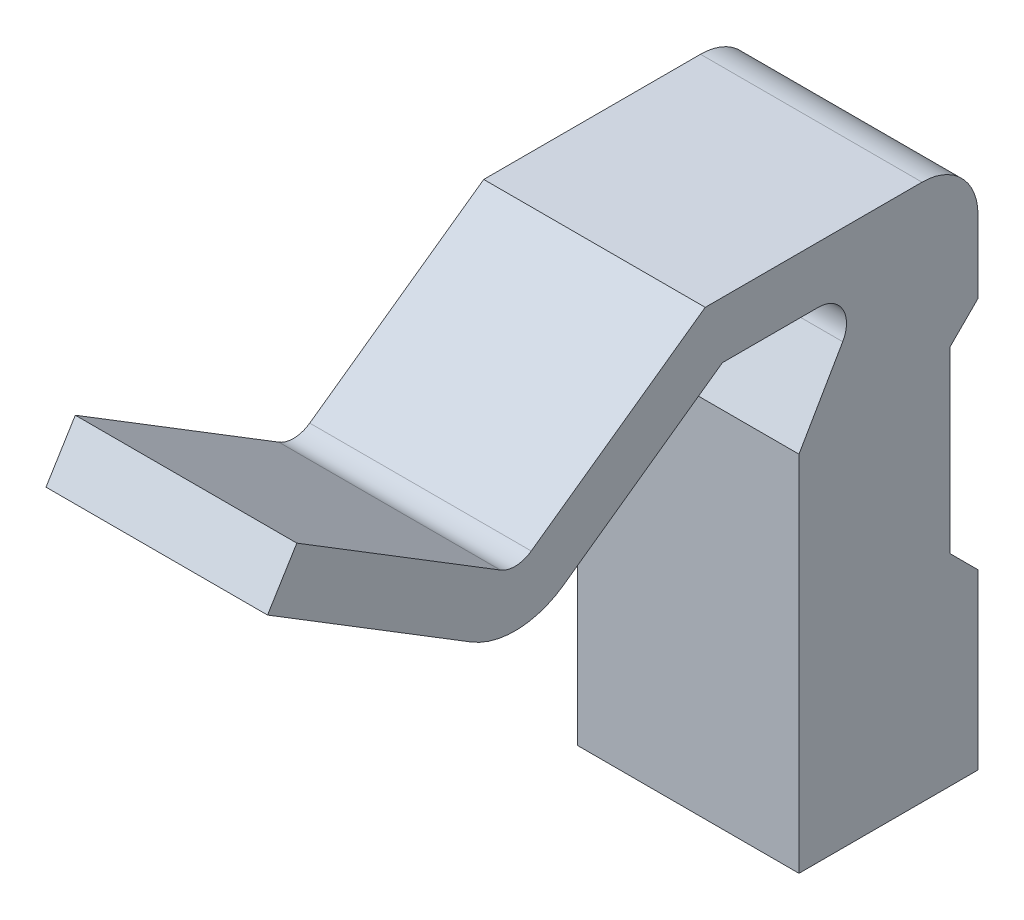
ISO-10303-21;
HEADER;
FILE_DESCRIPTION(('STEP AP214'),'2;1');
FILE_NAME('part.step','',(''),(''),'','','');
FILE_SCHEMA(('AUTOMOTIVE_DESIGN { 1 0 10303 214 1 1 1 1 }'));
ENDSEC;
DATA;
#1=APPLICATION_CONTEXT('core data for automotive mechanical design processes');
#2=APPLICATION_PROTOCOL_DEFINITION('international standard','automotive_design',2000,#1);
#3=PRODUCT_CONTEXT('',#1,'mechanical');
#4=PRODUCT('Part','Part','',(#3));
#5=PRODUCT_RELATED_PRODUCT_CATEGORY('part','',(#4));
#6=PRODUCT_DEFINITION_FORMATION('','',#4);
#7=PRODUCT_DEFINITION_CONTEXT('part definition',#1,'design');
#8=PRODUCT_DEFINITION('design','',#6,#7);
#9=PRODUCT_DEFINITION_SHAPE('','',#8);
#10=(LENGTH_UNIT() NAMED_UNIT(*) SI_UNIT(.MILLI.,.METRE.));
#11=(NAMED_UNIT(*) PLANE_ANGLE_UNIT() SI_UNIT($,.RADIAN.));
#12=(NAMED_UNIT(*) SI_UNIT($,.STERADIAN.) SOLID_ANGLE_UNIT());
#13=UNCERTAINTY_MEASURE_WITH_UNIT(LENGTH_MEASURE(1.E-05),#10,'distance_accuracy_value','');
#14=(GEOMETRIC_REPRESENTATION_CONTEXT(3) GLOBAL_UNCERTAINTY_ASSIGNED_CONTEXT((#13)) GLOBAL_UNIT_ASSIGNED_CONTEXT((#10,
#11,#12)) REPRESENTATION_CONTEXT('',''));
#15=CARTESIAN_POINT('',(0.,0.,0.));
#16=DIRECTION('',(0.,0.,1.));
#17=DIRECTION('',(1.,0.,0.));
#18=AXIS2_PLACEMENT_3D('',#15,#16,#17);
#19=CARTESIAN_POINT('',(-1.98,3.98,0.));
#20=DIRECTION('',(0.,0.,-1.));
#21=DIRECTION('',(0.,1.,0.));
#22=AXIS2_PLACEMENT_3D('',#19,#20,#21);
#23=PLANE('',#22);
#24=DIRECTION('',(0.,1.,0.));
#25=VECTOR('',#24,1.);
#26=CARTESIAN_POINT('',(1.98,3.98,0.));
#27=LINE('',#26,#25);
#28=CARTESIAN_POINT('',(1.98,3.98,0.));
#29=VERTEX_POINT('',#28);
#30=CARTESIAN_POINT('',(1.98,2.68,0.));
#31=VERTEX_POINT('',#30);
#32=EDGE_CURVE('E209',#29,#31,#27,.F.);
#33=ORIENTED_EDGE('',*,*,#32,.T.);
#34=DIRECTION('',(1.,0.,0.));
#35=VECTOR('',#34,1.);
#36=CARTESIAN_POINT('',(-1.98,2.68,0.));
#37=LINE('',#36,#35);
#38=CARTESIAN_POINT('',(-1.98,2.68,0.));
#39=VERTEX_POINT('',#38);
#40=EDGE_CURVE('E135',#39,#31,#37,.T.);
#41=ORIENTED_EDGE('',*,*,#40,.F.);
#42=DIRECTION('',(0.,1.,0.));
#43=VECTOR('',#42,1.);
#44=CARTESIAN_POINT('',(-1.98,3.98,0.));
#45=LINE('',#44,#43);
#46=CARTESIAN_POINT('',(-1.98,3.98,0.));
#47=VERTEX_POINT('',#46);
#48=EDGE_CURVE('E207',#39,#47,#45,.T.);
#49=ORIENTED_EDGE('',*,*,#48,.T.);
#50=DIRECTION('',(1.,0.,0.));
#51=VECTOR('',#50,1.);
#52=CARTESIAN_POINT('',(-1.98,3.98,0.));
#53=LINE('',#52,#51);
#54=EDGE_CURVE('E204',#29,#47,#53,.F.);
#55=ORIENTED_EDGE('',*,*,#54,.F.);
#56=EDGE_LOOP('',(#33,#41,#49,#55));
#57=FACE_BOUND('',#56,.T.);
#58=ADVANCED_FACE('F17',(#57),#23,.T.);
#59=CARTESIAN_POINT('',(-1.98,3.469746340674,2.850776637963));
#60=DIRECTION('',(1.,0.,0.));
#61=DIRECTION('',(0.,0.,-1.));
#62=AXIS2_PLACEMENT_3D('',#59,#60,#61);
#63=CYLINDRICAL_SURFACE('',#62,0.5);
#64=CARTESIAN_POINT('',(-1.98,3.469746340674,2.850776637963));
#65=DIRECTION('',(1.,0.,0.));
#66=DIRECTION('',(0.,0.,-1.));
#67=AXIS2_PLACEMENT_3D('',#64,#65,#66);
#68=CIRCLE('',#67,0.5);
#69=CARTESIAN_POINT('',(-1.98,3.969746340674,2.850776637963));
#70=VERTEX_POINT('',#69);
#71=CARTESIAN_POINT('',(-1.98,3.21913288984996,2.41811869192881));
#72=VERTEX_POINT('',#71);
#73=EDGE_CURVE('E118',#70,#72,#68,.F.);
#74=ORIENTED_EDGE('',*,*,#73,.T.);
#75=DIRECTION('',(1.,0.,0.));
#76=VECTOR('',#75,1.);
#77=CARTESIAN_POINT('',(-1.98,3.21913288984981,2.41811869192867));
#78=LINE('',#77,#76);
#79=CARTESIAN_POINT('',(1.98,3.21913288984981,2.41811869192867));
#80=VERTEX_POINT('',#79);
#81=EDGE_CURVE('E121',#80,#72,#78,.F.);
#82=ORIENTED_EDGE('',*,*,#81,.F.);
#83=CARTESIAN_POINT('',(1.98,3.469746340674,2.850776637963));
#84=DIRECTION('',(1.,0.,0.));
#85=DIRECTION('',(0.,0.,-1.));
#86=AXIS2_PLACEMENT_3D('',#83,#84,#85);
#87=CIRCLE('',#86,0.5);
#88=CARTESIAN_POINT('',(1.98,3.969746340674,2.850776637963));
#89=VERTEX_POINT('',#88);
#90=EDGE_CURVE('E20',#89,#80,#87,.F.);
#91=ORIENTED_EDGE('',*,*,#90,.F.);
#92=DIRECTION('',(1.,0.,0.));
#93=VECTOR('',#92,1.);
#94=CARTESIAN_POINT('',(-1.98,3.969746340674,2.850776637963));
#95=LINE('',#94,#93);
#96=EDGE_CURVE('E123',#70,#89,#95,.T.);
#97=ORIENTED_EDGE('',*,*,#96,.F.);
#98=EDGE_LOOP('',(#74,#82,#91,#97));
#99=FACE_BOUND('',#98,.T.);
#100=ADVANCED_FACE('F120',(#99),#63,.F.);
#101=CARTESIAN_POINT('',(-1.98,1.869296479712,3.2));
#102=DIRECTION('',(0.,0.501226901647726,0.865315892067527));
#103=DIRECTION('',(0.,-0.865315892067527,0.501226901647726));
#104=AXIS2_PLACEMENT_3D('',#101,#102,#103);
#105=PLANE('',#104);
#106=DIRECTION('',(0.,-0.865315892067527,0.501226901647726));
#107=VECTOR('',#106,1.);
#108=CARTESIAN_POINT('',(1.98,1.869296479712,3.2));
#109=LINE('',#108,#107);
#110=CARTESIAN_POINT('',(1.98,1.869296479712,3.2));
#111=VERTEX_POINT('',#110);
#112=EDGE_CURVE('E134',#111,#80,#109,.F.);
#113=ORIENTED_EDGE('',*,*,#112,.T.);
#114=ORIENTED_EDGE('',*,*,#81,.T.);
#115=DIRECTION('',(0.,-0.865315892067648,0.501226901647517));
#116=VECTOR('',#115,1.);
#117=CARTESIAN_POINT('',(-1.98,3.21913288985,2.418118691929));
#118=LINE('',#117,#116);
#119=CARTESIAN_POINT('',(-1.98,1.869296479712,3.2));
#120=VERTEX_POINT('',#119);
#121=EDGE_CURVE('E127',#72,#120,#118,.T.);
#122=ORIENTED_EDGE('',*,*,#121,.T.);
#123=DIRECTION('',(1.,0.,0.));
#124=VECTOR('',#123,1.);
#125=CARTESIAN_POINT('',(-1.98,1.869296479712,3.2));
#126=LINE('',#125,#124);
#127=EDGE_CURVE('E197',#111,#120,#126,.F.);
#128=ORIENTED_EDGE('',*,*,#127,.F.);
#129=EDGE_LOOP('',(#113,#114,#122,#128));
#130=FACE_BOUND('',#129,.T.);
#131=ADVANCED_FACE('F131',(#130),#105,.T.);
#132=CARTESIAN_POINT('',(-1.98,2.68,0.));
#133=DIRECTION('',(0.,-0.707106781186548,-0.707106781186548));
#134=DIRECTION('',(0.,0.707106781186548,-0.707106781186548));
#135=AXIS2_PLACEMENT_3D('',#132,#133,#134);
#136=PLANE('',#135);
#137=DIRECTION('',(0.,0.707106781186548,-0.707106781186548));
#138=VECTOR('',#137,1.);
#139=CARTESIAN_POINT('',(1.98,2.68,0.));
#140=LINE('',#139,#138);
#141=CARTESIAN_POINT('',(1.98,2.18,0.5));
#142=VERTEX_POINT('',#141);
#143=EDGE_CURVE('E194',#31,#142,#140,.F.);
#144=ORIENTED_EDGE('',*,*,#143,.T.);
#145=DIRECTION('',(-1.,0.,0.));
#146=VECTOR('',#145,1.);
#147=CARTESIAN_POINT('',(-1.98,2.18,0.5));
#148=LINE('',#147,#146);
#149=CARTESIAN_POINT('',(-1.98,2.18,0.5));
#150=VERTEX_POINT('',#149);
#151=EDGE_CURVE('E281',#150,#142,#148,.F.);
#152=ORIENTED_EDGE('',*,*,#151,.F.);
#153=DIRECTION('',(0.,0.707106781186548,-0.707106781186547));
#154=VECTOR('',#153,1.);
#155=CARTESIAN_POINT('',(-1.98,2.18,0.5));
#156=LINE('',#155,#154);
#157=EDGE_CURVE('E153',#150,#39,#156,.T.);
#158=ORIENTED_EDGE('',*,*,#157,.T.);
#159=ORIENTED_EDGE('',*,*,#40,.T.);
#160=EDGE_LOOP('',(#144,#152,#158,#159));
#161=FACE_BOUND('',#160,.T.);
#162=ADVANCED_FACE('F356',(#161),#136,.T.);
#163=CARTESIAN_POINT('',(-1.98,-1.02,0.5));
#164=DIRECTION('',(0.,0.707106781186548,-0.707106781186548));
#165=DIRECTION('',(0.,0.707106781186548,0.707106781186548));
#166=AXIS2_PLACEMENT_3D('',#163,#164,#165);
#167=PLANE('',#166);
#168=DIRECTION('',(0.,0.707106781186548,0.707106781186548));
#169=VECTOR('',#168,1.);
#170=CARTESIAN_POINT('',(1.98,-1.02,0.5));
#171=LINE('',#170,#169);
#172=CARTESIAN_POINT('',(1.98,-1.02,0.5));
#173=VERTEX_POINT('',#172);
#174=CARTESIAN_POINT('',(1.98,-1.52,0.));
#175=VERTEX_POINT('',#174);
#176=EDGE_CURVE('E190',#173,#175,#171,.F.);
#177=ORIENTED_EDGE('',*,*,#176,.T.);
#178=DIRECTION('',(1.,0.,0.));
#179=VECTOR('',#178,1.);
#180=CARTESIAN_POINT('',(-1.98,-1.52,0.));
#181=LINE('',#180,#179);
#182=CARTESIAN_POINT('',(-1.98,-1.52,0.));
#183=VERTEX_POINT('',#182);
#184=EDGE_CURVE('E290',#183,#175,#181,.T.);
#185=ORIENTED_EDGE('',*,*,#184,.F.);
#186=DIRECTION('',(0.,0.707106781186548,0.707106781186548));
#187=VECTOR('',#186,1.);
#188=CARTESIAN_POINT('',(-1.98,-1.52,0.));
#189=LINE('',#188,#187);
#190=CARTESIAN_POINT('',(-1.98,-1.02,0.5));
#191=VERTEX_POINT('',#190);
#192=EDGE_CURVE('E150',#183,#191,#189,.T.);
#193=ORIENTED_EDGE('',*,*,#192,.T.);
#194=DIRECTION('',(-1.,0.,0.));
#195=VECTOR('',#194,1.);
#196=CARTESIAN_POINT('',(-1.98,-1.02,0.5));
#197=LINE('',#196,#195);
#198=EDGE_CURVE('E181',#173,#191,#197,.T.);
#199=ORIENTED_EDGE('',*,*,#198,.F.);
#200=EDGE_LOOP('',(#177,#185,#193,#199));
#201=FACE_BOUND('',#200,.T.);
#202=ADVANCED_FACE('F450',(#201),#167,.T.);
#203=CARTESIAN_POINT('',(-1.98,3.98,1.));
#204=DIRECTION('',(1.,0.,0.));
#205=DIRECTION('',(0.,0.,-1.));
#206=AXIS2_PLACEMENT_3D('',#203,#204,#205);
#207=CYLINDRICAL_SURFACE('',#206,1.);
#208=CARTESIAN_POINT('',(1.98,3.98,1.));
#209=DIRECTION('',(1.,0.,0.));
#210=DIRECTION('',(0.,0.,-1.));
#211=AXIS2_PLACEMENT_3D('',#208,#209,#210);
#212=CIRCLE('',#211,1.);
#213=CARTESIAN_POINT('',(1.98,4.98,1.));
#214=VERTEX_POINT('',#213);
#215=EDGE_CURVE('E193',#214,#29,#212,.F.);
#216=ORIENTED_EDGE('',*,*,#215,.T.);
#217=ORIENTED_EDGE('',*,*,#54,.T.);
#218=CARTESIAN_POINT('',(-1.98,3.98,1.));
#219=DIRECTION('',(1.,0.,0.));
#220=DIRECTION('',(0.,0.,-1.));
#221=AXIS2_PLACEMENT_3D('',#218,#219,#220);
#222=CIRCLE('',#221,1.);
#223=CARTESIAN_POINT('',(-1.98,4.98,1.));
#224=VERTEX_POINT('',#223);
#225=EDGE_CURVE('E235',#47,#224,#222,.T.);
#226=ORIENTED_EDGE('',*,*,#225,.T.);
#227=DIRECTION('',(1.,0.,0.));
#228=VECTOR('',#227,1.);
#229=CARTESIAN_POINT('',(-1.98,4.98,1.));
#230=LINE('',#229,#228);
#231=EDGE_CURVE('E180',#214,#224,#230,.F.);
#232=ORIENTED_EDGE('',*,*,#231,.F.);
#233=EDGE_LOOP('',(#216,#217,#226,#232));
#234=FACE_BOUND('',#233,.T.);
#235=ADVANCED_FACE('F250',(#234),#207,.T.);
#236=CARTESIAN_POINT('',(-1.98,3.17,8.275621));
#237=DIRECTION('',(1.,0.,0.));
#238=DIRECTION('',(0.,0.,-1.));
#239=AXIS2_PLACEMENT_3D('',#236,#237,#238);
#240=CYLINDRICAL_SURFACE('',#239,0.5);
#241=CARTESIAN_POINT('',(-1.98,3.17,8.275621));
#242=DIRECTION('',(1.,0.,0.));
#243=DIRECTION('',(0.,0.,-1.));
#244=AXIS2_PLACEMENT_3D('',#241,#242,#243);
#245=CIRCLE('',#244,0.5);
#246=CARTESIAN_POINT('',(-1.98,2.76287831598612,7.98535916233384));
#247=VERTEX_POINT('',#246);
#248=CARTESIAN_POINT('',(-1.98,2.74401882240635,8.5374225208834));
#249=VERTEX_POINT('',#248);
#250=EDGE_CURVE('E167',#247,#249,#245,.F.);
#251=ORIENTED_EDGE('',*,*,#250,.T.);
#252=DIRECTION('',(1.,0.,0.));
#253=VECTOR('',#252,1.);
#254=CARTESIAN_POINT('',(-1.98,2.74401882240635,8.5374225208834));
#255=LINE('',#254,#253);
#256=CARTESIAN_POINT('',(1.98,2.74401882240665,8.53742252088316));
#257=VERTEX_POINT('',#256);
#258=EDGE_CURVE('E159',#257,#249,#255,.F.);
#259=ORIENTED_EDGE('',*,*,#258,.F.);
#260=CARTESIAN_POINT('',(1.98,3.17,8.275621));
#261=DIRECTION('',(1.,0.,0.));
#262=DIRECTION('',(0.,0.,-1.));
#263=AXIS2_PLACEMENT_3D('',#260,#261,#262);
#264=CIRCLE('',#263,0.5);
#265=CARTESIAN_POINT('',(1.98,2.76287831598605,7.98535916233394));
#266=VERTEX_POINT('',#265);
#267=EDGE_CURVE('E163',#266,#257,#264,.F.);
#268=ORIENTED_EDGE('',*,*,#267,.F.);
#269=DIRECTION('',(1.,0.,0.));
#270=VECTOR('',#269,1.);
#271=CARTESIAN_POINT('',(-1.98,2.762878315986,7.985359162334));
#272=LINE('',#271,#270);
#273=EDGE_CURVE('E187',#247,#266,#272,.T.);
#274=ORIENTED_EDGE('',*,*,#273,.F.);
#275=EDGE_LOOP('',(#251,#259,#268,#274));
#276=FACE_BOUND('',#275,.T.);
#277=ADVANCED_FACE('F393',(#276),#240,.F.);
#278=CARTESIAN_POINT('',(-1.98,4.128384095306,12.699787756551));
#279=DIRECTION('',(0.,0.523603041765821,0.851962355185709));
#280=DIRECTION('',(0.,-0.851962355185709,0.523603041765821));
#281=AXIS2_PLACEMENT_3D('',#278,#279,#280);
#282=PLANE('',#281);
#283=DIRECTION('',(0.,-0.851962355185709,0.523603041765821));
#284=VECTOR('',#283,1.);
#285=CARTESIAN_POINT('',(1.98,4.128384095306,12.699787756551));
#286=LINE('',#285,#284);
#287=CARTESIAN_POINT('',(1.98,4.12838409530583,12.6997877565518));
#288=VERTEX_POINT('',#287);
#289=CARTESIAN_POINT('',(1.98,4.98034645049094,12.1761847147859));
#290=VERTEX_POINT('',#289);
#291=EDGE_CURVE('E154',#288,#290,#286,.F.);
#292=ORIENTED_EDGE('',*,*,#291,.T.);
#293=DIRECTION('',(1.,0.,0.));
#294=VECTOR('',#293,1.);
#295=CARTESIAN_POINT('',(-1.98,4.980346450491,12.176184714786));
#296=LINE('',#295,#294);
#297=CARTESIAN_POINT('',(-1.98,4.980346450491,12.176184714786));
#298=VERTEX_POINT('',#297);
#299=EDGE_CURVE('E173',#298,#290,#296,.T.);
#300=ORIENTED_EDGE('',*,*,#299,.F.);
#301=DIRECTION('',(0.,-0.851962355185434,0.523603041766268));
#302=VECTOR('',#301,1.);
#303=CARTESIAN_POINT('',(-1.98,4.980346450491,12.176184714786));
#304=LINE('',#303,#302);
#305=CARTESIAN_POINT('',(-1.98,4.12838409530595,12.699787756552));
#306=VERTEX_POINT('',#305);
#307=EDGE_CURVE('E128',#298,#306,#304,.T.);
#308=ORIENTED_EDGE('',*,*,#307,.T.);
#309=DIRECTION('',(1.,0.,0.));
#310=VECTOR('',#309,1.);
#311=CARTESIAN_POINT('',(-1.98,4.12838409530593,12.699787756552));
#312=LINE('',#311,#310);
#313=EDGE_CURVE('E158',#288,#306,#312,.F.);
#314=ORIENTED_EDGE('',*,*,#313,.F.);
#315=EDGE_LOOP('',(#292,#300,#308,#314));
#316=FACE_BOUND('',#315,.T.);
#317=ADVANCED_FACE('F382',(#316),#282,.T.);
#318=CARTESIAN_POINT('',(-1.98,1.649894369646,4.637612014088));
#319=DIRECTION('',(1.,0.,0.));
#320=DIRECTION('',(0.,0.,-1.));
#321=AXIS2_PLACEMENT_3D('',#318,#319,#320);
#322=PLANE('',#321);
#323=DIRECTION('',(0.,1.,0.));
#324=VECTOR('',#323,1.);
#325=CARTESIAN_POINT('',(-1.98,-4.62,3.2));
#326=LINE('',#325,#324);
#327=CARTESIAN_POINT('',(-1.98,-4.62,3.2));
#328=VERTEX_POINT('',#327);
#329=EDGE_CURVE('E140',#120,#328,#326,.F.);
#330=ORIENTED_EDGE('',*,*,#329,.F.);
#331=ORIENTED_EDGE('',*,*,#121,.F.);
#332=ORIENTED_EDGE('',*,*,#73,.F.);
#333=DIRECTION('',(0.,0.,-1.));
#334=VECTOR('',#333,1.);
#335=CARTESIAN_POINT('',(-1.98,3.969746340674,2.850776637963));
#336=LINE('',#335,#334);
#337=CARTESIAN_POINT('',(-1.98,3.969746340674,4.570021649955));
#338=VERTEX_POINT('',#337);
#339=EDGE_CURVE('E142',#338,#70,#336,.T.);
#340=ORIENTED_EDGE('',*,*,#339,.F.);
#341=DIRECTION('',(0.,0.580523675333083,-0.814243368028116));
#342=VECTOR('',#341,1.);
#343=CARTESIAN_POINT('',(-1.98,3.969746340674,4.570021649955));
#344=LINE('',#343,#342);
#345=CARTESIAN_POINT('',(-1.98,1.94863494795636,7.40483548699994));
#346=VERTEX_POINT('',#345);
#347=EDGE_CURVE('E301',#346,#338,#344,.T.);
#348=ORIENTED_EDGE('',*,*,#347,.F.);
#349=CARTESIAN_POINT('',(-1.98,3.17,8.275621));
#350=DIRECTION('',(1.,0.,0.));
#351=DIRECTION('',(0.,0.,-1.));
#352=AXIS2_PLACEMENT_3D('',#349,#350,#351);
#353=CIRCLE('',#352,1.5);
#354=CARTESIAN_POINT('',(-1.98,1.89205646722122,9.06102556264887));
#355=VERTEX_POINT('',#354);
#356=EDGE_CURVE('E241',#355,#346,#353,.T.);
#357=ORIENTED_EDGE('',*,*,#356,.F.);
#358=DIRECTION('',(0.,-0.523603041765821,-0.851962355185709));
#359=VECTOR('',#358,1.);
#360=CARTESIAN_POINT('',(-1.98,1.892056467221,9.061025562649));
#361=LINE('',#360,#359);
#362=EDGE_CURVE('E155',#306,#355,#361,.T.);
#363=ORIENTED_EDGE('',*,*,#362,.F.);
#364=ORIENTED_EDGE('',*,*,#307,.F.);
#365=DIRECTION('',(0.,0.523603041765821,0.851962355185709));
#366=VECTOR('',#365,1.);
#367=CARTESIAN_POINT('',(-1.98,4.980346450491,12.176184714786));
#368=LINE('',#367,#366);
#369=EDGE_CURVE('E170',#249,#298,#368,.T.);
#370=ORIENTED_EDGE('',*,*,#369,.F.);
#371=ORIENTED_EDGE('',*,*,#250,.F.);
#372=DIRECTION('',(0.,-0.580523675333083,0.814243368028116));
#373=VECTOR('',#372,1.);
#374=CARTESIAN_POINT('',(-1.98,2.762878315986,7.985359162334));
#375=LINE('',#374,#373);
#376=CARTESIAN_POINT('',(-1.98,4.98000000000106,4.87562100000113));
#377=VERTEX_POINT('',#376);
#378=EDGE_CURVE('E184',#377,#247,#375,.T.);
#379=ORIENTED_EDGE('',*,*,#378,.F.);
#380=DIRECTION('',(0.,0.,1.));
#381=VECTOR('',#380,1.);
#382=CARTESIAN_POINT('',(-1.98,4.98,4.875621));
#383=LINE('',#382,#381);
#384=EDGE_CURVE('E177',#224,#377,#383,.T.);
#385=ORIENTED_EDGE('',*,*,#384,.F.);
#386=ORIENTED_EDGE('',*,*,#225,.F.);
#387=ORIENTED_EDGE('',*,*,#48,.F.);
#388=ORIENTED_EDGE('',*,*,#157,.F.);
#389=DIRECTION('',(0.,1.,0.));
#390=VECTOR('',#389,1.);
#391=CARTESIAN_POINT('',(-1.98,2.18,0.5));
#392=LINE('',#391,#390);
#393=EDGE_CURVE('E284',#191,#150,#392,.T.);
#394=ORIENTED_EDGE('',*,*,#393,.F.);
#395=ORIENTED_EDGE('',*,*,#192,.F.);
#396=DIRECTION('',(0.,1.,0.));
#397=VECTOR('',#396,1.);
#398=CARTESIAN_POINT('',(-1.98,-1.52,0.));
#399=LINE('',#398,#397);
#400=CARTESIAN_POINT('',(-1.98,-4.62,0.));
#401=VERTEX_POINT('',#400);
#402=EDGE_CURVE('E293',#401,#183,#399,.T.);
#403=ORIENTED_EDGE('',*,*,#402,.F.);
#404=DIRECTION('',(0.,0.,-1.));
#405=VECTOR('',#404,1.);
#406=CARTESIAN_POINT('',(-1.98,-4.62,0.));
#407=LINE('',#406,#405);
#408=EDGE_CURVE('E201',#328,#401,#407,.T.);
#409=ORIENTED_EDGE('',*,*,#408,.F.);
#410=EDGE_LOOP('',(#330,#331,#332,#340,#348,#357,#363,#364,#370,#371,#379,#385,#386,#387,#388,
#394,#395,#403,#409));
#411=FACE_BOUND('',#410,.T.);
#412=ADVANCED_FACE('F137',(#411),#322,.F.);
#413=CARTESIAN_POINT('',(-1.98,3.969746340674,2.850776637963));
#414=DIRECTION('',(0.,-1.,0.));
#415=DIRECTION('',(0.,0.,-1.));
#416=AXIS2_PLACEMENT_3D('',#413,#414,#415);
#417=PLANE('',#416);
#418=DIRECTION('',(0.,0.,-1.));
#419=VECTOR('',#418,1.);
#420=CARTESIAN_POINT('',(1.98,3.969746340674,2.850776637963));
#421=LINE('',#420,#419);
#422=CARTESIAN_POINT('',(1.98,3.969746340674,4.570021649955));
#423=VERTEX_POINT('',#422);
#424=EDGE_CURVE('E35',#89,#423,#421,.F.);
#425=ORIENTED_EDGE('',*,*,#424,.T.);
#426=DIRECTION('',(1.,0.,0.));
#427=VECTOR('',#426,1.);
#428=CARTESIAN_POINT('',(-1.98,3.969746340674,4.570021649955));
#429=LINE('',#428,#427);
#430=EDGE_CURVE('E304',#338,#423,#429,.T.);
#431=ORIENTED_EDGE('',*,*,#430,.F.);
#432=ORIENTED_EDGE('',*,*,#339,.T.);
#433=ORIENTED_EDGE('',*,*,#96,.T.);
#434=EDGE_LOOP('',(#425,#431,#432,#433));
#435=FACE_BOUND('',#434,.T.);
#436=ADVANCED_FACE('F405',(#435),#417,.T.);
#437=CARTESIAN_POINT('',(-1.98,-4.62,3.2));
#438=DIRECTION('',(0.,0.,1.));
#439=DIRECTION('',(1.,0.,0.));
#440=AXIS2_PLACEMENT_3D('',#437,#438,#439);
#441=PLANE('',#440);
#442=DIRECTION('',(0.,1.,0.));
#443=VECTOR('',#442,1.);
#444=CARTESIAN_POINT('',(1.98,1.649894369646,3.2));
#445=LINE('',#444,#443);
#446=CARTESIAN_POINT('',(1.98,-4.62,3.2));
#447=VERTEX_POINT('',#446);
#448=EDGE_CURVE('E218',#111,#447,#445,.F.);
#449=ORIENTED_EDGE('',*,*,#448,.F.);
#450=ORIENTED_EDGE('',*,*,#127,.T.);
#451=ORIENTED_EDGE('',*,*,#329,.T.);
#452=DIRECTION('',(1.,0.,0.));
#453=VECTOR('',#452,1.);
#454=CARTESIAN_POINT('',(-1.98,-4.62,3.2));
#455=LINE('',#454,#453);
#456=EDGE_CURVE('E296',#447,#328,#455,.F.);
#457=ORIENTED_EDGE('',*,*,#456,.F.);
#458=EDGE_LOOP('',(#449,#450,#451,#457));
#459=FACE_BOUND('',#458,.T.);
#460=ADVANCED_FACE('F407',(#459),#441,.T.);
#461=CARTESIAN_POINT('',(-1.98,-4.62,0.));
#462=DIRECTION('',(0.,-1.,0.));
#463=DIRECTION('',(0.,0.,-1.));
#464=AXIS2_PLACEMENT_3D('',#461,#462,#463);
#465=PLANE('',#464);
#466=DIRECTION('',(0.,0.,-1.));
#467=VECTOR('',#466,1.);
#468=CARTESIAN_POINT('',(1.98,-4.62,4.637612014088));
#469=LINE('',#468,#467);
#470=CARTESIAN_POINT('',(1.98,-4.62,0.));
#471=VERTEX_POINT('',#470);
#472=EDGE_CURVE('E221',#447,#471,#469,.T.);
#473=ORIENTED_EDGE('',*,*,#472,.F.);
#474=ORIENTED_EDGE('',*,*,#456,.T.);
#475=ORIENTED_EDGE('',*,*,#408,.T.);
#476=DIRECTION('',(1.,0.,0.));
#477=VECTOR('',#476,1.);
#478=CARTESIAN_POINT('',(-1.98,-4.62,0.));
#479=LINE('',#478,#477);
#480=EDGE_CURVE('E287',#471,#401,#479,.F.);
#481=ORIENTED_EDGE('',*,*,#480,.F.);
#482=EDGE_LOOP('',(#473,#474,#475,#481));
#483=FACE_BOUND('',#482,.T.);
#484=ADVANCED_FACE('F414',(#483),#465,.T.);
#485=CARTESIAN_POINT('',(-1.98,-1.52,0.));
#486=DIRECTION('',(0.,0.,-1.));
#487=DIRECTION('',(0.,1.,0.));
#488=AXIS2_PLACEMENT_3D('',#485,#486,#487);
#489=PLANE('',#488);
#490=DIRECTION('',(0.,1.,0.));
#491=VECTOR('',#490,1.);
#492=CARTESIAN_POINT('',(1.98,1.649894369646,0.));
#493=LINE('',#492,#491);
#494=EDGE_CURVE('E363',#471,#175,#493,.T.);
#495=ORIENTED_EDGE('',*,*,#494,.F.);
#496=ORIENTED_EDGE('',*,*,#480,.T.);
#497=ORIENTED_EDGE('',*,*,#402,.T.);
#498=ORIENTED_EDGE('',*,*,#184,.T.);
#499=EDGE_LOOP('',(#495,#496,#497,#498));
#500=FACE_BOUND('',#499,.T.);
#501=ADVANCED_FACE('F437',(#500),#489,.T.);
#502=CARTESIAN_POINT('',(-1.98,2.18,0.5));
#503=DIRECTION('',(0.,0.,-1.));
#504=DIRECTION('',(-1.,0.,0.));
#505=AXIS2_PLACEMENT_3D('',#502,#503,#504);
#506=PLANE('',#505);
#507=DIRECTION('',(0.,1.,0.));
#508=VECTOR('',#507,1.);
#509=CARTESIAN_POINT('',(1.98,1.649894369646,0.5));
#510=LINE('',#509,#508);
#511=EDGE_CURVE('E360',#173,#142,#510,.T.);
#512=ORIENTED_EDGE('',*,*,#511,.F.);
#513=ORIENTED_EDGE('',*,*,#198,.T.);
#514=ORIENTED_EDGE('',*,*,#393,.T.);
#515=ORIENTED_EDGE('',*,*,#151,.T.);
#516=EDGE_LOOP('',(#512,#513,#514,#515));
#517=FACE_BOUND('',#516,.T.);
#518=ADVANCED_FACE('F359',(#517),#506,.T.);
#519=CARTESIAN_POINT('',(-1.98,4.98,4.875621));
#520=DIRECTION('',(0.,1.,0.));
#521=DIRECTION('',(0.,0.,1.));
#522=AXIS2_PLACEMENT_3D('',#519,#520,#521);
#523=PLANE('',#522);
#524=DIRECTION('',(0.,0.,-1.));
#525=VECTOR('',#524,1.);
#526=CARTESIAN_POINT('',(1.98,4.98,4.637612014088));
#527=LINE('',#526,#525);
#528=CARTESIAN_POINT('',(1.98,4.98000000000053,4.87562100000038));
#529=VERTEX_POINT('',#528);
#530=EDGE_CURVE('E260',#214,#529,#527,.F.);
#531=ORIENTED_EDGE('',*,*,#530,.F.);
#532=ORIENTED_EDGE('',*,*,#231,.T.);
#533=ORIENTED_EDGE('',*,*,#384,.T.);
#534=DIRECTION('',(1.,0.,0.));
#535=VECTOR('',#534,1.);
#536=CARTESIAN_POINT('',(-1.98,4.98000000000159,4.87562100000113));
#537=LINE('',#536,#535);
#538=EDGE_CURVE('E174',#529,#377,#537,.F.);
#539=ORIENTED_EDGE('',*,*,#538,.F.);
#540=EDGE_LOOP('',(#531,#532,#533,#539));
#541=FACE_BOUND('',#540,.T.);
#542=ADVANCED_FACE('F273',(#541),#523,.T.);
#543=CARTESIAN_POINT('',(-1.98,2.762878315986,7.985359162334));
#544=DIRECTION('',(0.,0.814243368028116,0.580523675333083));
#545=DIRECTION('',(0.,-0.580523675333083,0.814243368028116));
#546=AXIS2_PLACEMENT_3D('',#543,#544,#545);
#547=PLANE('',#546);
#548=DIRECTION('',(0.,-0.580523675332666,0.814243368028413));
#549=VECTOR('',#548,1.);
#550=CARTESIAN_POINT('',(1.98,4.98,4.875621));
#551=LINE('',#550,#549);
#552=EDGE_CURVE('E333',#529,#266,#551,.T.);
#553=ORIENTED_EDGE('',*,*,#552,.F.);
#554=ORIENTED_EDGE('',*,*,#538,.T.);
#555=ORIENTED_EDGE('',*,*,#378,.T.);
#556=ORIENTED_EDGE('',*,*,#273,.T.);
#557=EDGE_LOOP('',(#553,#554,#555,#556));
#558=FACE_BOUND('',#557,.T.);
#559=ADVANCED_FACE('F332',(#558),#547,.T.);
#560=CARTESIAN_POINT('',(-1.98,4.980346450491,12.176184714786));
#561=DIRECTION('',(0.,0.851962355185709,-0.523603041765821));
#562=DIRECTION('',(0.,0.523603041765821,0.851962355185709));
#563=AXIS2_PLACEMENT_3D('',#560,#561,#562);
#564=PLANE('',#563);
#565=DIRECTION('',(0.,0.523603041765668,0.851962355185803));
#566=VECTOR('',#565,1.);
#567=CARTESIAN_POINT('',(1.98,2.744018822407,8.537422520883));
#568=LINE('',#567,#566);
#569=EDGE_CURVE('E391',#257,#290,#568,.T.);
#570=ORIENTED_EDGE('',*,*,#569,.F.);
#571=ORIENTED_EDGE('',*,*,#258,.T.);
#572=ORIENTED_EDGE('',*,*,#369,.T.);
#573=ORIENTED_EDGE('',*,*,#299,.T.);
#574=EDGE_LOOP('',(#570,#571,#572,#573));
#575=FACE_BOUND('',#574,.T.);
#576=ADVANCED_FACE('F389',(#575),#564,.T.);
#577=CARTESIAN_POINT('',(-1.98,1.892056467221,9.061025562649));
#578=DIRECTION('',(0.,-0.851962355185709,0.523603041765821));
#579=DIRECTION('',(0.,-0.523603041765821,-0.851962355185709));
#580=AXIS2_PLACEMENT_3D('',#577,#578,#579);
#581=PLANE('',#580);
#582=DIRECTION('',(0.,-0.523603041765837,-0.851962355185699));
#583=VECTOR('',#582,1.);
#584=CARTESIAN_POINT('',(1.98,4.128384095306,12.699787756552));
#585=LINE('',#584,#583);
#586=CARTESIAN_POINT('',(1.98,1.89205646722123,9.06102556264888));
#587=VERTEX_POINT('',#586);
#588=EDGE_CURVE('E240',#288,#587,#585,.T.);
#589=ORIENTED_EDGE('',*,*,#588,.F.);
#590=ORIENTED_EDGE('',*,*,#313,.T.);
#591=ORIENTED_EDGE('',*,*,#362,.T.);
#592=DIRECTION('',(1.,0.,0.));
#593=VECTOR('',#592,1.);
#594=CARTESIAN_POINT('',(-1.98,1.89205646722144,9.06102556264873));
#595=LINE('',#594,#593);
#596=EDGE_CURVE('E243',#587,#355,#595,.F.);
#597=ORIENTED_EDGE('',*,*,#596,.F.);
#598=EDGE_LOOP('',(#589,#590,#591,#597));
#599=FACE_BOUND('',#598,.T.);
#600=ADVANCED_FACE('F379',(#599),#581,.T.);
#601=CARTESIAN_POINT('',(-1.98,3.17,8.275621));
#602=DIRECTION('',(1.,0.,0.));
#603=DIRECTION('',(0.,0.,-1.));
#604=AXIS2_PLACEMENT_3D('',#601,#602,#603);
#605=CYLINDRICAL_SURFACE('',#604,1.5);
#606=CARTESIAN_POINT('',(1.98,3.17,8.275621));
#607=DIRECTION('',(1.,0.,0.));
#608=DIRECTION('',(0.,0.,-1.));
#609=AXIS2_PLACEMENT_3D('',#606,#607,#608);
#610=CIRCLE('',#609,1.5);
#611=CARTESIAN_POINT('',(1.98,1.94863494795668,7.40483548700047));
#612=VERTEX_POINT('',#611);
#613=EDGE_CURVE('E26',#587,#612,#610,.T.);
#614=ORIENTED_EDGE('',*,*,#613,.F.);
#615=ORIENTED_EDGE('',*,*,#596,.T.);
#616=ORIENTED_EDGE('',*,*,#356,.T.);
#617=DIRECTION('',(1.,0.,0.));
#618=VECTOR('',#617,1.);
#619=CARTESIAN_POINT('',(-1.98,1.94863494795607,7.40483548700034));
#620=LINE('',#619,#618);
#621=EDGE_CURVE('E222',#612,#346,#620,.F.);
#622=ORIENTED_EDGE('',*,*,#621,.F.);
#623=EDGE_LOOP('',(#614,#615,#616,#622));
#624=FACE_BOUND('',#623,.T.);
#625=ADVANCED_FACE('F374',(#624),#605,.T.);
#626=CARTESIAN_POINT('',(-1.98,3.969746340674,4.570021649955));
#627=DIRECTION('',(0.,-0.814243368028116,-0.580523675333083));
#628=DIRECTION('',(0.,0.580523675333083,-0.814243368028116));
#629=AXIS2_PLACEMENT_3D('',#626,#627,#628);
#630=PLANE('',#629);
#631=DIRECTION('',(0.,0.580523675332817,-0.814243368028305));
#632=VECTOR('',#631,1.);
#633=CARTESIAN_POINT('',(1.98,1.948634947957,7.404835487001));
#634=LINE('',#633,#632);
#635=EDGE_CURVE('E11',#612,#423,#634,.T.);
#636=ORIENTED_EDGE('',*,*,#635,.F.);
#637=ORIENTED_EDGE('',*,*,#621,.T.);
#638=ORIENTED_EDGE('',*,*,#347,.T.);
#639=ORIENTED_EDGE('',*,*,#430,.T.);
#640=EDGE_LOOP('',(#636,#637,#638,#639));
#641=FACE_BOUND('',#640,.T.);
#642=ADVANCED_FACE('F373',(#641),#630,.T.);
#643=CARTESIAN_POINT('',(1.98,1.649894369646,4.637612014088));
#644=DIRECTION('',(1.,0.,0.));
#645=DIRECTION('',(0.,0.,-1.));
#646=AXIS2_PLACEMENT_3D('',#643,#644,#645);
#647=PLANE('',#646);
#648=ORIENTED_EDGE('',*,*,#90,.T.);
#649=ORIENTED_EDGE('',*,*,#112,.F.);
#650=ORIENTED_EDGE('',*,*,#448,.T.);
#651=ORIENTED_EDGE('',*,*,#472,.T.);
#652=ORIENTED_EDGE('',*,*,#494,.T.);
#653=ORIENTED_EDGE('',*,*,#176,.F.);
#654=ORIENTED_EDGE('',*,*,#511,.T.);
#655=ORIENTED_EDGE('',*,*,#143,.F.);
#656=ORIENTED_EDGE('',*,*,#32,.F.);
#657=ORIENTED_EDGE('',*,*,#215,.F.);
#658=ORIENTED_EDGE('',*,*,#530,.T.);
#659=ORIENTED_EDGE('',*,*,#552,.T.);
#660=ORIENTED_EDGE('',*,*,#267,.T.);
#661=ORIENTED_EDGE('',*,*,#569,.T.);
#662=ORIENTED_EDGE('',*,*,#291,.F.);
#663=ORIENTED_EDGE('',*,*,#588,.T.);
#664=ORIENTED_EDGE('',*,*,#613,.T.);
#665=ORIENTED_EDGE('',*,*,#635,.T.);
#666=ORIENTED_EDGE('',*,*,#424,.F.);
#667=EDGE_LOOP('',(#648,#649,#650,#651,#652,#653,#654,#655,#656,#657,#658,#659,#660,#661,#662,
#663,#664,#665,#666));
#668=FACE_BOUND('',#667,.T.);
#669=ADVANCED_FACE('F258',(#668),#647,.T.);
#670=CLOSED_SHELL('',(#58,#100,#131,#162,#202,#235,#277,#317,#412,#436,#460,#484,#501,#518,#542,
#559,#576,#600,#625,#642,#669));
#671=MANIFOLD_SOLID_BREP('B1',#670);
#672=ADVANCED_BREP_SHAPE_REPRESENTATION('',(#18,#671),#14);
#673=SHAPE_DEFINITION_REPRESENTATION(#9,#672);
ENDSEC;
END-ISO-10303-21;
